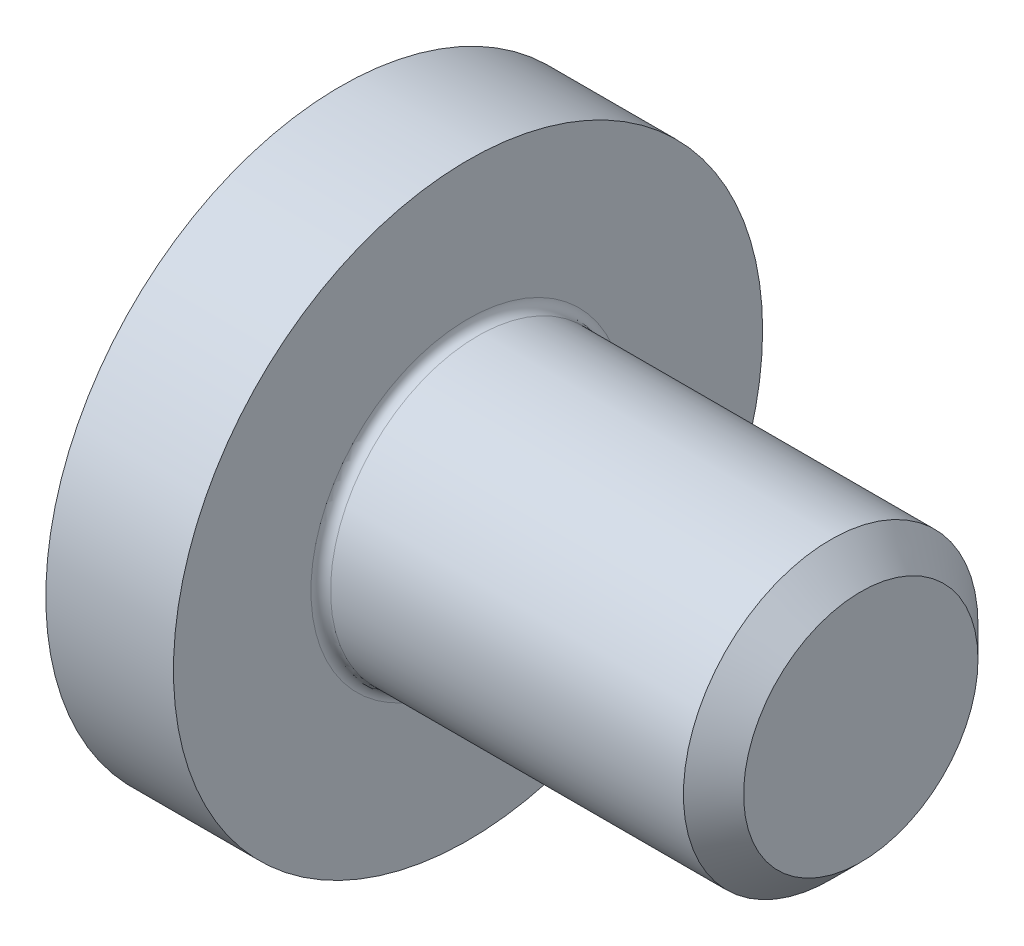
ISO-10303-21;
HEADER;
FILE_DESCRIPTION(('STEP AP214'),'2;1');
FILE_NAME('part.step','',(''),(''),'','','');
FILE_SCHEMA(('AUTOMOTIVE_DESIGN { 1 0 10303 214 1 1 1 1 }'));
ENDSEC;
DATA;
#1=APPLICATION_CONTEXT('core data for automotive mechanical design processes');
#2=APPLICATION_PROTOCOL_DEFINITION('international standard','automotive_design',2000,#1);
#3=PRODUCT_CONTEXT('',#1,'mechanical');
#4=PRODUCT('Part','Part','',(#3));
#5=PRODUCT_RELATED_PRODUCT_CATEGORY('part','',(#4));
#6=PRODUCT_DEFINITION_FORMATION('','',#4);
#7=PRODUCT_DEFINITION_CONTEXT('part definition',#1,'design');
#8=PRODUCT_DEFINITION('design','',#6,#7);
#9=PRODUCT_DEFINITION_SHAPE('','',#8);
#10=(LENGTH_UNIT() NAMED_UNIT(*) SI_UNIT(.MILLI.,.METRE.));
#11=(NAMED_UNIT(*) PLANE_ANGLE_UNIT() SI_UNIT($,.RADIAN.));
#12=(NAMED_UNIT(*) SI_UNIT($,.STERADIAN.) SOLID_ANGLE_UNIT());
#13=UNCERTAINTY_MEASURE_WITH_UNIT(LENGTH_MEASURE(1.E-05),#10,'distance_accuracy_value','');
#14=(GEOMETRIC_REPRESENTATION_CONTEXT(3) GLOBAL_UNCERTAINTY_ASSIGNED_CONTEXT((#13)) GLOBAL_UNIT_ASSIGNED_CONTEXT((#10,
#11,#12)) REPRESENTATION_CONTEXT('',''));
#15=CARTESIAN_POINT('',(0.,0.,0.));
#16=DIRECTION('',(0.,0.,1.));
#17=DIRECTION('',(1.,0.,0.));
#18=AXIS2_PLACEMENT_3D('',#15,#16,#17);
#19=CARTESIAN_POINT('',(-1.3,0.,0.));
#20=DIRECTION('',(1.,0.,0.));
#21=DIRECTION('',(0.,0.,-1.));
#22=AXIS2_PLACEMENT_3D('',#19,#20,#21);
#23=PLANE('',#22);
#24=CARTESIAN_POINT('',(-1.3,0.,0.));
#25=DIRECTION('',(1.,0.,0.));
#26=DIRECTION('',(0.,0.,-1.));
#27=AXIS2_PLACEMENT_3D('',#24,#25,#26);
#28=CIRCLE('',#27,3.);
#29=CARTESIAN_POINT('',(-1.3,0.,-3.));
#30=VERTEX_POINT('',#29);
#31=EDGE_CURVE('E115',#30,#30,#28,.T.);
#32=ORIENTED_EDGE('',*,*,#31,.F.);
#33=EDGE_LOOP('',(#32));
#34=FACE_BOUND('',#33,.T.);
#35=DIRECTION('',(0.,0.5,-0.866025403784438));
#36=VECTOR('',#35,1.);
#37=CARTESIAN_POINT('',(-1.3,-0.86602540378444,0.));
#38=LINE('',#37,#36);
#39=CARTESIAN_POINT('',(-1.3,-0.86602540378444,0.));
#40=VERTEX_POINT('',#39);
#41=CARTESIAN_POINT('',(-1.3,-0.43301270189222,-0.75));
#42=VERTEX_POINT('',#41);
#43=EDGE_CURVE('E100',#40,#42,#38,.T.);
#44=ORIENTED_EDGE('',*,*,#43,.T.);
#45=DIRECTION('',(0.,1.,0.));
#46=VECTOR('',#45,1.);
#47=CARTESIAN_POINT('',(-1.3,-0.43301270189222,-0.75));
#48=LINE('',#47,#46);
#49=CARTESIAN_POINT('',(-1.3,0.43301270189222,-0.75));
#50=VERTEX_POINT('',#49);
#51=EDGE_CURVE('E88',#42,#50,#48,.T.);
#52=ORIENTED_EDGE('',*,*,#51,.T.);
#53=DIRECTION('',(0.,0.5,0.866025403784438));
#54=VECTOR('',#53,1.);
#55=CARTESIAN_POINT('',(-1.3,0.43301270189222,-0.75));
#56=LINE('',#55,#54);
#57=CARTESIAN_POINT('',(-1.3,0.86602540378444,0.));
#58=VERTEX_POINT('',#57);
#59=EDGE_CURVE('E99',#50,#58,#56,.T.);
#60=ORIENTED_EDGE('',*,*,#59,.T.);
#61=DIRECTION('',(0.,-0.5,0.866025403784438));
#62=VECTOR('',#61,1.);
#63=CARTESIAN_POINT('',(-1.3,0.86602540378444,0.));
#64=LINE('',#63,#62);
#65=CARTESIAN_POINT('',(-1.3,0.43301270189222,0.75));
#66=VERTEX_POINT('',#65);
#67=EDGE_CURVE('E125',#58,#66,#64,.T.);
#68=ORIENTED_EDGE('',*,*,#67,.T.);
#69=DIRECTION('',(0.,-1.,0.));
#70=VECTOR('',#69,1.);
#71=CARTESIAN_POINT('',(-1.3,0.43301270189222,0.75));
#72=LINE('',#71,#70);
#73=CARTESIAN_POINT('',(-1.3,-0.43301270189222,0.75));
#74=VERTEX_POINT('',#73);
#75=EDGE_CURVE('E130',#66,#74,#72,.T.);
#76=ORIENTED_EDGE('',*,*,#75,.T.);
#77=DIRECTION('',(0.,-0.5,-0.866025403784438));
#78=VECTOR('',#77,1.);
#79=CARTESIAN_POINT('',(-1.3,-0.43301270189222,0.75));
#80=LINE('',#79,#78);
#81=EDGE_CURVE('E114',#74,#40,#80,.T.);
#82=ORIENTED_EDGE('',*,*,#81,.T.);
#83=EDGE_LOOP('',(#44,#52,#60,#68,#76,#82));
#84=FACE_BOUND('',#83,.T.);
#85=ADVANCED_FACE('F16',(#34,#84),#23,.F.);
#86=CARTESIAN_POINT('',(4.,0.,0.));
#87=DIRECTION('',(1.,0.,0.));
#88=DIRECTION('',(0.,0.,-1.));
#89=AXIS2_PLACEMENT_3D('',#86,#87,#88);
#90=CYLINDRICAL_SURFACE('',#89,3.);
#91=CARTESIAN_POINT('',(0.,0.,0.));
#92=DIRECTION('',(1.,0.,0.));
#93=DIRECTION('',(0.,0.,-1.));
#94=AXIS2_PLACEMENT_3D('',#91,#92,#93);
#95=CIRCLE('',#94,3.);
#96=CARTESIAN_POINT('',(0.,0.,-3.));
#97=VERTEX_POINT('',#96);
#98=EDGE_CURVE('E137',#97,#97,#95,.T.);
#99=ORIENTED_EDGE('',*,*,#98,.F.);
#100=EDGE_LOOP('',(#99));
#101=FACE_BOUND('',#100,.T.);
#102=ORIENTED_EDGE('',*,*,#31,.T.);
#103=EDGE_LOOP('',(#102));
#104=FACE_BOUND('',#103,.T.);
#105=ADVANCED_FACE('F279',(#101,#104),#90,.T.);
#106=CARTESIAN_POINT('',(0.7,-0.86602540378444,0.));
#107=DIRECTION('',(0.,0.866025403784439,0.5));
#108=DIRECTION('',(0.,-0.5,0.866025403784439));
#109=AXIS2_PLACEMENT_3D('',#106,#107,#108);
#110=PLANE('',#109);
#111=ORIENTED_EDGE('',*,*,#43,.F.);
#112=DIRECTION('',(-1.,0.,0.));
#113=VECTOR('',#112,1.);
#114=CARTESIAN_POINT('',(0.7,-0.86602540378444,0.));
#115=LINE('',#114,#113);
#116=CARTESIAN_POINT('',(0.7,-0.86602540378444,0.));
#117=VERTEX_POINT('',#116);
#118=EDGE_CURVE('E142',#117,#40,#115,.T.);
#119=ORIENTED_EDGE('',*,*,#118,.F.);
#120=DIRECTION('',(0.,0.5,-0.866025403784438));
#121=VECTOR('',#120,1.);
#122=CARTESIAN_POINT('',(0.7,-0.86602540378444,0.));
#123=LINE('',#122,#121);
#124=CARTESIAN_POINT('',(0.7,-0.649519052838329,-0.375));
#125=VERTEX_POINT('',#124);
#126=EDGE_CURVE('E144',#117,#125,#123,.T.);
#127=ORIENTED_EDGE('',*,*,#126,.T.);
#128=DIRECTION('',(0.,0.5,-0.866025403784438));
#129=VECTOR('',#128,1.);
#130=CARTESIAN_POINT('',(0.7,-0.64951905283833,-0.375000000000001));
#131=LINE('',#130,#129);
#132=CARTESIAN_POINT('',(0.7,-0.43301270189222,-0.75));
#133=VERTEX_POINT('',#132);
#134=EDGE_CURVE('E109',#125,#133,#131,.T.);
#135=ORIENTED_EDGE('',*,*,#134,.T.);
#136=DIRECTION('',(-1.,0.,0.));
#137=VECTOR('',#136,1.);
#138=CARTESIAN_POINT('',(0.7,-0.43301270189222,-0.75));
#139=LINE('',#138,#137);
#140=EDGE_CURVE('E92',#133,#42,#139,.T.);
#141=ORIENTED_EDGE('',*,*,#140,.T.);
#142=EDGE_LOOP('',(#111,#119,#127,#135,#141));
#143=FACE_BOUND('',#142,.T.);
#144=ADVANCED_FACE('F105',(#143),#110,.T.);
#145=CARTESIAN_POINT('',(0.7,-0.43301270189222,-0.75));
#146=DIRECTION('',(0.,0.,1.));
#147=DIRECTION('',(1.,0.,0.));
#148=AXIS2_PLACEMENT_3D('',#145,#146,#147);
#149=PLANE('',#148);
#150=ORIENTED_EDGE('',*,*,#51,.F.);
#151=ORIENTED_EDGE('',*,*,#140,.F.);
#152=DIRECTION('',(0.,1.,0.));
#153=VECTOR('',#152,1.);
#154=CARTESIAN_POINT('',(0.7,-0.43301270189222,-0.75));
#155=LINE('',#154,#153);
#156=CARTESIAN_POINT('',(0.7,0.,-0.75));
#157=VERTEX_POINT('',#156);
#158=EDGE_CURVE('E110',#133,#157,#155,.T.);
#159=ORIENTED_EDGE('',*,*,#158,.T.);
#160=DIRECTION('',(0.,1.,0.));
#161=VECTOR('',#160,1.);
#162=CARTESIAN_POINT('',(0.7,0.,-0.75));
#163=LINE('',#162,#161);
#164=CARTESIAN_POINT('',(0.7,0.43301270189222,-0.75));
#165=VERTEX_POINT('',#164);
#166=EDGE_CURVE('E156',#157,#165,#163,.T.);
#167=ORIENTED_EDGE('',*,*,#166,.T.);
#168=DIRECTION('',(-1.,0.,0.));
#169=VECTOR('',#168,1.);
#170=CARTESIAN_POINT('',(0.7,0.43301270189222,-0.75));
#171=LINE('',#170,#169);
#172=EDGE_CURVE('E95',#165,#50,#171,.T.);
#173=ORIENTED_EDGE('',*,*,#172,.T.);
#174=EDGE_LOOP('',(#150,#151,#159,#167,#173));
#175=FACE_BOUND('',#174,.T.);
#176=ADVANCED_FACE('F90',(#175),#149,.T.);
#177=CARTESIAN_POINT('',(0.7,0.43301270189222,-0.75));
#178=DIRECTION('',(0.,-0.866025403784439,0.5));
#179=DIRECTION('',(0.,-0.5,-0.866025403784439));
#180=AXIS2_PLACEMENT_3D('',#177,#178,#179);
#181=PLANE('',#180);
#182=ORIENTED_EDGE('',*,*,#59,.F.);
#183=ORIENTED_EDGE('',*,*,#172,.F.);
#184=DIRECTION('',(0.,0.5,0.866025403784439));
#185=VECTOR('',#184,1.);
#186=CARTESIAN_POINT('',(0.7,0.43301270189222,-0.75));
#187=LINE('',#186,#185);
#188=CARTESIAN_POINT('',(0.7,0.64951905283833,-0.375));
#189=VERTEX_POINT('',#188);
#190=EDGE_CURVE('E163',#165,#189,#187,.T.);
#191=ORIENTED_EDGE('',*,*,#190,.T.);
#192=DIRECTION('',(0.,0.5,0.866025403784438));
#193=VECTOR('',#192,1.);
#194=CARTESIAN_POINT('',(0.7,0.64951905283833,-0.375));
#195=LINE('',#194,#193);
#196=CARTESIAN_POINT('',(0.7,0.86602540378444,0.));
#197=VERTEX_POINT('',#196);
#198=EDGE_CURVE('E168',#189,#197,#195,.T.);
#199=ORIENTED_EDGE('',*,*,#198,.T.);
#200=DIRECTION('',(-1.,0.,0.));
#201=VECTOR('',#200,1.);
#202=CARTESIAN_POINT('',(0.7,0.86602540378444,0.));
#203=LINE('',#202,#201);
#204=EDGE_CURVE('E173',#197,#58,#203,.T.);
#205=ORIENTED_EDGE('',*,*,#204,.T.);
#206=EDGE_LOOP('',(#182,#183,#191,#199,#205));
#207=FACE_BOUND('',#206,.T.);
#208=ADVANCED_FACE('F295',(#207),#181,.T.);
#209=CARTESIAN_POINT('',(0.7,0.86602540378444,0.));
#210=DIRECTION('',(0.,-0.866025403784439,-0.5));
#211=DIRECTION('',(0.,0.5,-0.866025403784439));
#212=AXIS2_PLACEMENT_3D('',#209,#210,#211);
#213=PLANE('',#212);
#214=ORIENTED_EDGE('',*,*,#67,.F.);
#215=ORIENTED_EDGE('',*,*,#204,.F.);
#216=DIRECTION('',(0.,-0.5,0.866025403784438));
#217=VECTOR('',#216,1.);
#218=CARTESIAN_POINT('',(0.7,0.86602540378444,0.));
#219=LINE('',#218,#217);
#220=CARTESIAN_POINT('',(0.7,0.64951905283833,0.375));
#221=VERTEX_POINT('',#220);
#222=EDGE_CURVE('E178',#197,#221,#219,.T.);
#223=ORIENTED_EDGE('',*,*,#222,.T.);
#224=DIRECTION('',(0.,-0.5,0.866025403784439));
#225=VECTOR('',#224,1.);
#226=CARTESIAN_POINT('',(0.7,0.64951905283833,0.375));
#227=LINE('',#226,#225);
#228=CARTESIAN_POINT('',(0.7,0.43301270189222,0.75));
#229=VERTEX_POINT('',#228);
#230=EDGE_CURVE('E183',#221,#229,#227,.T.);
#231=ORIENTED_EDGE('',*,*,#230,.T.);
#232=DIRECTION('',(-1.,0.,0.));
#233=VECTOR('',#232,1.);
#234=CARTESIAN_POINT('',(0.7,0.43301270189222,0.75));
#235=LINE('',#234,#233);
#236=EDGE_CURVE('E188',#229,#66,#235,.T.);
#237=ORIENTED_EDGE('',*,*,#236,.T.);
#238=EDGE_LOOP('',(#214,#215,#223,#231,#237));
#239=FACE_BOUND('',#238,.T.);
#240=ADVANCED_FACE('F298',(#239),#213,.T.);
#241=CARTESIAN_POINT('',(0.7,0.43301270189222,0.75));
#242=DIRECTION('',(0.,0.,-1.));
#243=DIRECTION('',(-1.,0.,0.));
#244=AXIS2_PLACEMENT_3D('',#241,#242,#243);
#245=PLANE('',#244);
#246=ORIENTED_EDGE('',*,*,#75,.F.);
#247=ORIENTED_EDGE('',*,*,#236,.F.);
#248=DIRECTION('',(0.,-1.,0.));
#249=VECTOR('',#248,1.);
#250=CARTESIAN_POINT('',(0.7,0.43301270189222,0.75));
#251=LINE('',#250,#249);
#252=CARTESIAN_POINT('',(0.7,0.,0.75));
#253=VERTEX_POINT('',#252);
#254=EDGE_CURVE('E193',#229,#253,#251,.T.);
#255=ORIENTED_EDGE('',*,*,#254,.T.);
#256=DIRECTION('',(0.,-1.,0.));
#257=VECTOR('',#256,1.);
#258=CARTESIAN_POINT('',(0.7,0.,0.75));
#259=LINE('',#258,#257);
#260=CARTESIAN_POINT('',(0.7,-0.43301270189222,0.75));
#261=VERTEX_POINT('',#260);
#262=EDGE_CURVE('E198',#253,#261,#259,.T.);
#263=ORIENTED_EDGE('',*,*,#262,.T.);
#264=DIRECTION('',(-1.,0.,0.));
#265=VECTOR('',#264,1.);
#266=CARTESIAN_POINT('',(0.7,-0.43301270189222,0.75));
#267=LINE('',#266,#265);
#268=EDGE_CURVE('E203',#261,#74,#267,.T.);
#269=ORIENTED_EDGE('',*,*,#268,.T.);
#270=EDGE_LOOP('',(#246,#247,#255,#263,#269));
#271=FACE_BOUND('',#270,.T.);
#272=ADVANCED_FACE('F302',(#271),#245,.T.);
#273=CARTESIAN_POINT('',(0.7,-0.43301270189222,0.75));
#274=DIRECTION('',(0.,0.866025403784439,-0.5));
#275=DIRECTION('',(0.,0.5,0.866025403784439));
#276=AXIS2_PLACEMENT_3D('',#273,#274,#275);
#277=PLANE('',#276);
#278=ORIENTED_EDGE('',*,*,#81,.F.);
#279=ORIENTED_EDGE('',*,*,#268,.F.);
#280=DIRECTION('',(0.,-0.5,-0.866025403784439));
#281=VECTOR('',#280,1.);
#282=CARTESIAN_POINT('',(0.7,-0.43301270189222,0.75));
#283=LINE('',#282,#281);
#284=CARTESIAN_POINT('',(0.7,-0.64951905283833,0.375));
#285=VERTEX_POINT('',#284);
#286=EDGE_CURVE('E208',#261,#285,#283,.T.);
#287=ORIENTED_EDGE('',*,*,#286,.T.);
#288=DIRECTION('',(0.,-0.5,-0.866025403784438));
#289=VECTOR('',#288,1.);
#290=CARTESIAN_POINT('',(0.7,-0.64951905283833,0.375));
#291=LINE('',#290,#289);
#292=EDGE_CURVE('E213',#285,#117,#291,.T.);
#293=ORIENTED_EDGE('',*,*,#292,.T.);
#294=ORIENTED_EDGE('',*,*,#118,.T.);
#295=EDGE_LOOP('',(#278,#279,#287,#293,#294));
#296=FACE_BOUND('',#295,.T.);
#297=ADVANCED_FACE('F275',(#296),#277,.T.);
#298=CARTESIAN_POINT('',(0.,3.,0.));
#299=DIRECTION('',(-1.,0.,0.));
#300=DIRECTION('',(0.,0.,1.));
#301=AXIS2_PLACEMENT_3D('',#298,#299,#300);
#302=PLANE('',#301);
#303=CARTESIAN_POINT('',(0.,0.,0.));
#304=DIRECTION('',(1.,0.,0.));
#305=DIRECTION('',(0.,0.,-1.));
#306=AXIS2_PLACEMENT_3D('',#303,#304,#305);
#307=CIRCLE('',#306,1.59999999999992);
#308=CARTESIAN_POINT('',(0.,0.,-1.59999999999992));
#309=VERTEX_POINT('',#308);
#310=EDGE_CURVE('E218',#309,#309,#307,.T.);
#311=ORIENTED_EDGE('',*,*,#310,.F.);
#312=EDGE_LOOP('',(#311));
#313=FACE_BOUND('',#312,.T.);
#314=ORIENTED_EDGE('',*,*,#98,.T.);
#315=EDGE_LOOP('',(#314));
#316=FACE_BOUND('',#315,.T.);
#317=ADVANCED_FACE('F271',(#313,#316),#302,.F.);
#318=CARTESIAN_POINT('',(0.7,0.,0.));
#319=DIRECTION('',(1.,0.,0.));
#320=DIRECTION('',(0.,0.,-1.));
#321=AXIS2_PLACEMENT_3D('',#318,#319,#320);
#322=PLANE('',#321);
#323=CARTESIAN_POINT('',(0.7,0.,0.));
#324=DIRECTION('',(1.,0.,0.));
#325=DIRECTION('',(0.,-0.866025403784439,0.5));
#326=AXIS2_PLACEMENT_3D('',#323,#324,#325);
#327=CIRCLE('',#326,0.75);
#328=EDGE_CURVE('E34',#285,#125,#327,.T.);
#329=ORIENTED_EDGE('',*,*,#328,.T.);
#330=ORIENTED_EDGE('',*,*,#126,.F.);
#331=ORIENTED_EDGE('',*,*,#292,.F.);
#332=EDGE_LOOP('',(#329,#330,#331));
#333=FACE_BOUND('',#332,.T.);
#334=ADVANCED_FACE('F274',(#333),#322,.F.);
#335=CARTESIAN_POINT('',(0.7,0.,0.));
#336=DIRECTION('',(1.,0.,0.));
#337=DIRECTION('',(0.,-0.866025403784439,-0.499999999999999));
#338=AXIS2_PLACEMENT_3D('',#335,#336,#337);
#339=CIRCLE('',#338,0.75);
#340=EDGE_CURVE('E224',#125,#157,#339,.T.);
#341=ORIENTED_EDGE('',*,*,#340,.T.);
#342=ORIENTED_EDGE('',*,*,#158,.F.);
#343=ORIENTED_EDGE('',*,*,#134,.F.);
#344=EDGE_LOOP('',(#341,#342,#343));
#345=FACE_BOUND('',#344,.T.);
#346=ADVANCED_FACE('F311',(#345),#322,.F.);
#347=CARTESIAN_POINT('',(0.7,0.,0.));
#348=DIRECTION('',(1.,0.,0.));
#349=DIRECTION('',(0.,0.,-1.));
#350=AXIS2_PLACEMENT_3D('',#347,#348,#349);
#351=CIRCLE('',#350,0.75);
#352=EDGE_CURVE('E229',#157,#189,#351,.T.);
#353=ORIENTED_EDGE('',*,*,#352,.T.);
#354=ORIENTED_EDGE('',*,*,#190,.F.);
#355=ORIENTED_EDGE('',*,*,#166,.F.);
#356=EDGE_LOOP('',(#353,#354,#355));
#357=FACE_BOUND('',#356,.T.);
#358=ADVANCED_FACE('F379',(#357),#322,.F.);
#359=CARTESIAN_POINT('',(0.7,0.,0.));
#360=DIRECTION('',(1.,0.,0.));
#361=DIRECTION('',(0.,0.866025403784439,-0.5));
#362=AXIS2_PLACEMENT_3D('',#359,#360,#361);
#363=CIRCLE('',#362,0.75);
#364=EDGE_CURVE('E234',#189,#221,#363,.T.);
#365=ORIENTED_EDGE('',*,*,#364,.T.);
#366=ORIENTED_EDGE('',*,*,#222,.F.);
#367=ORIENTED_EDGE('',*,*,#198,.F.);
#368=EDGE_LOOP('',(#365,#366,#367));
#369=FACE_BOUND('',#368,.T.);
#370=ADVANCED_FACE('F370',(#369),#322,.F.);
#371=CARTESIAN_POINT('',(0.7,0.,0.));
#372=DIRECTION('',(1.,0.,0.));
#373=DIRECTION('',(0.,0.866025403784439,0.499999999999999));
#374=AXIS2_PLACEMENT_3D('',#371,#372,#373);
#375=CIRCLE('',#374,0.75);
#376=EDGE_CURVE('E239',#221,#253,#375,.T.);
#377=ORIENTED_EDGE('',*,*,#376,.T.);
#378=ORIENTED_EDGE('',*,*,#254,.F.);
#379=ORIENTED_EDGE('',*,*,#230,.F.);
#380=EDGE_LOOP('',(#377,#378,#379));
#381=FACE_BOUND('',#380,.T.);
#382=ADVANCED_FACE('F361',(#381),#322,.F.);
#383=CARTESIAN_POINT('',(0.7,0.,0.));
#384=DIRECTION('',(1.,0.,0.));
#385=DIRECTION('',(0.,0.,1.));
#386=AXIS2_PLACEMENT_3D('',#383,#384,#385);
#387=CIRCLE('',#386,0.75);
#388=EDGE_CURVE('E244',#253,#285,#387,.T.);
#389=ORIENTED_EDGE('',*,*,#388,.T.);
#390=ORIENTED_EDGE('',*,*,#286,.F.);
#391=ORIENTED_EDGE('',*,*,#262,.F.);
#392=EDGE_LOOP('',(#389,#390,#391));
#393=FACE_BOUND('',#392,.T.);
#394=ADVANCED_FACE('F267',(#393),#322,.F.);
#395=CARTESIAN_POINT('',(0.099999999999922,0.,0.));
#396=DIRECTION('',(1.,0.,0.));
#397=DIRECTION('',(0.,0.,-1.));
#398=AXIS2_PLACEMENT_3D('',#395,#396,#397);
#399=TOROIDAL_SURFACE('',#398,1.59999999999992,0.099999999999922);
#400=CARTESIAN_POINT('',(0.1,0.,0.));
#401=DIRECTION('',(1.,0.,0.));
#402=DIRECTION('',(0.,0.,-1.));
#403=AXIS2_PLACEMENT_3D('',#400,#401,#402);
#404=CIRCLE('',#403,1.5);
#405=CARTESIAN_POINT('',(0.1,0.,-1.5));
#406=VERTEX_POINT('',#405);
#407=EDGE_CURVE('E248',#406,#406,#404,.T.);
#408=ORIENTED_EDGE('',*,*,#407,.F.);
#409=EDGE_LOOP('',(#408));
#410=FACE_BOUND('',#409,.T.);
#411=ORIENTED_EDGE('',*,*,#310,.T.);
#412=EDGE_LOOP('',(#411));
#413=FACE_BOUND('',#412,.T.);
#414=ADVANCED_FACE('F264',(#410,#413),#399,.F.);
#415=CARTESIAN_POINT('',(0.7,0.,0.));
#416=DIRECTION('',(-1.,0.,0.));
#417=DIRECTION('',(0.,0.,1.));
#418=AXIS2_PLACEMENT_3D('',#415,#416,#417);
#419=CONICAL_SURFACE('',#418,0.75,1.04719755119662);
#420=CARTESIAN_POINT('',(1.1330127018922,0.,0.));
#421=VERTEX_POINT('',#420);
#422=VERTEX_LOOP('',#421);
#423=FACE_BOUND('',#422,.T.);
#424=ORIENTED_EDGE('',*,*,#352,.F.);
#425=ORIENTED_EDGE('',*,*,#340,.F.);
#426=ORIENTED_EDGE('',*,*,#328,.F.);
#427=ORIENTED_EDGE('',*,*,#388,.F.);
#428=ORIENTED_EDGE('',*,*,#376,.F.);
#429=ORIENTED_EDGE('',*,*,#364,.F.);
#430=EDGE_LOOP('',(#424,#425,#426,#427,#428,#429));
#431=FACE_BOUND('',#430,.T.);
#432=ADVANCED_FACE('F260',(#423,#431),#419,.F.);
#433=CARTESIAN_POINT('',(4.,0.,0.));
#434=DIRECTION('',(1.,0.,0.));
#435=DIRECTION('',(0.,0.,-1.));
#436=AXIS2_PLACEMENT_3D('',#433,#434,#435);
#437=CYLINDRICAL_SURFACE('',#436,1.5);
#438=CARTESIAN_POINT('',(3.6935,0.,0.));
#439=DIRECTION('',(1.,0.,0.));
#440=DIRECTION('',(0.,0.,-1.));
#441=AXIS2_PLACEMENT_3D('',#438,#439,#440);
#442=CIRCLE('',#441,1.5);
#443=CARTESIAN_POINT('',(3.6935,0.,-1.5));
#444=VERTEX_POINT('',#443);
#445=EDGE_CURVE('E24',#444,#444,#442,.T.);
#446=ORIENTED_EDGE('',*,*,#445,.F.);
#447=EDGE_LOOP('',(#446));
#448=FACE_BOUND('',#447,.T.);
#449=ORIENTED_EDGE('',*,*,#407,.T.);
#450=EDGE_LOOP('',(#449));
#451=FACE_BOUND('',#450,.T.);
#452=ADVANCED_FACE('F257',(#448,#451),#437,.T.);
#453=CARTESIAN_POINT('',(3.6935,0.,0.));
#454=DIRECTION('',(-1.,0.,0.));
#455=DIRECTION('',(0.,0.,1.));
#456=AXIS2_PLACEMENT_3D('',#453,#454,#455);
#457=CONICAL_SURFACE('',#456,1.5,0.785398163397448);
#458=CARTESIAN_POINT('',(4.,0.,0.));
#459=DIRECTION('',(1.,0.,0.));
#460=DIRECTION('',(0.,0.,-1.));
#461=AXIS2_PLACEMENT_3D('',#458,#459,#460);
#462=CIRCLE('',#461,1.1935);
#463=CARTESIAN_POINT('',(4.,0.,-1.1935));
#464=VERTEX_POINT('',#463);
#465=EDGE_CURVE('E11',#464,#464,#462,.T.);
#466=ORIENTED_EDGE('',*,*,#465,.F.);
#467=EDGE_LOOP('',(#466));
#468=FACE_BOUND('',#467,.T.);
#469=ORIENTED_EDGE('',*,*,#445,.T.);
#470=EDGE_LOOP('',(#469));
#471=FACE_BOUND('',#470,.T.);
#472=ADVANCED_FACE('F255',(#468,#471),#457,.T.);
#473=CARTESIAN_POINT('',(4.,1.1935,0.));
#474=DIRECTION('',(-1.,0.,0.));
#475=DIRECTION('',(0.,0.,1.));
#476=AXIS2_PLACEMENT_3D('',#473,#474,#475);
#477=PLANE('',#476);
#478=ORIENTED_EDGE('',*,*,#465,.T.);
#479=EDGE_LOOP('',(#478));
#480=FACE_BOUND('',#479,.T.);
#481=ADVANCED_FACE('F18',(#480),#477,.F.);
#482=CLOSED_SHELL('',(#85,#105,#144,#176,#208,#240,#272,#297,#317,#334,#346,#358,#370,#382,#394,
#414,#432,#452,#472,#481));
#483=MANIFOLD_SOLID_BREP('B1',#482);
#484=ADVANCED_BREP_SHAPE_REPRESENTATION('',(#18,#483),#14);
#485=SHAPE_DEFINITION_REPRESENTATION(#9,#484);
ENDSEC;
END-ISO-10303-21;
